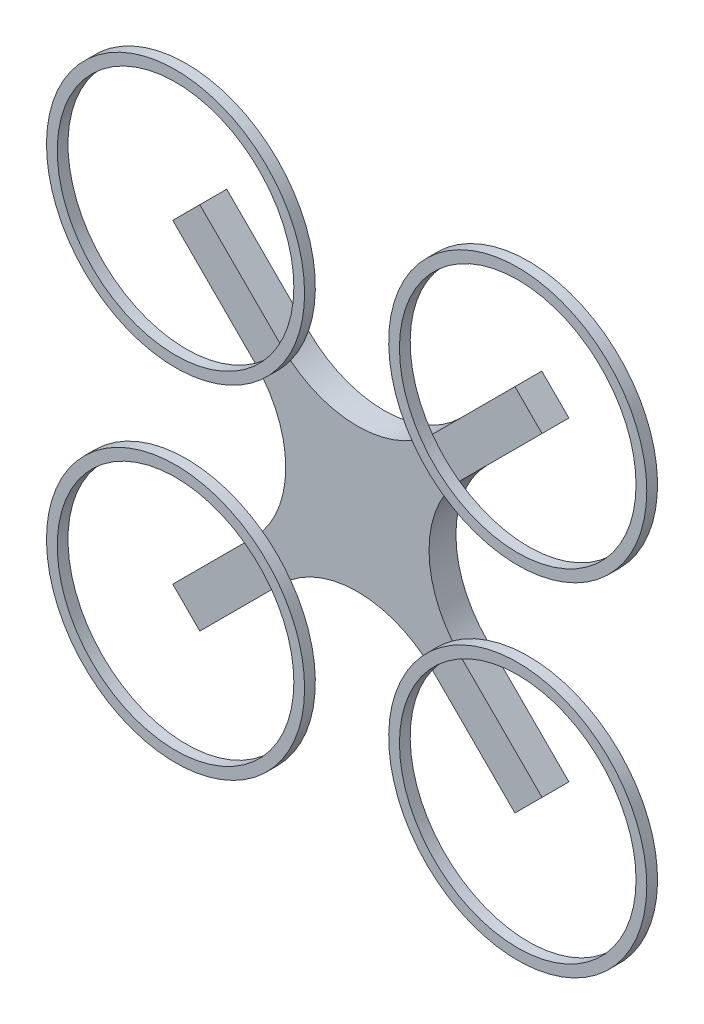
ISO-10303-21;
HEADER;
FILE_DESCRIPTION(('STEP AP214'),'2;1');
FILE_NAME('part.step','',(''),(''),'','','');
FILE_SCHEMA(('AUTOMOTIVE_DESIGN { 1 0 10303 214 1 1 1 1 }'));
ENDSEC;
DATA;
#1=APPLICATION_CONTEXT('core data for automotive mechanical design processes');
#2=APPLICATION_PROTOCOL_DEFINITION('international standard','automotive_design',2000,#1);
#3=PRODUCT_CONTEXT('',#1,'mechanical');
#4=PRODUCT('Part','Part','',(#3));
#5=PRODUCT_RELATED_PRODUCT_CATEGORY('part','',(#4));
#6=PRODUCT_DEFINITION_FORMATION('','',#4);
#7=PRODUCT_DEFINITION_CONTEXT('part definition',#1,'design');
#8=PRODUCT_DEFINITION('design','',#6,#7);
#9=PRODUCT_DEFINITION_SHAPE('','',#8);
#10=(LENGTH_UNIT() NAMED_UNIT(*) SI_UNIT(.MILLI.,.METRE.));
#11=(NAMED_UNIT(*) PLANE_ANGLE_UNIT() SI_UNIT($,.RADIAN.));
#12=(NAMED_UNIT(*) SI_UNIT($,.STERADIAN.) SOLID_ANGLE_UNIT());
#13=UNCERTAINTY_MEASURE_WITH_UNIT(LENGTH_MEASURE(1.E-05),#10,'distance_accuracy_value','');
#14=(GEOMETRIC_REPRESENTATION_CONTEXT(3) GLOBAL_UNCERTAINTY_ASSIGNED_CONTEXT((#13)) GLOBAL_UNIT_ASSIGNED_CONTEXT((#10,
#11,#12)) REPRESENTATION_CONTEXT('',''));
#15=CARTESIAN_POINT('',(0.,0.,0.));
#16=DIRECTION('',(0.,0.,1.));
#17=DIRECTION('',(1.,0.,0.));
#18=AXIS2_PLACEMENT_3D('',#15,#16,#17);
#19=CARTESIAN_POINT('',(0.,0.,5.));
#20=DIRECTION('',(0.,0.,1.));
#21=DIRECTION('',(1.,0.,0.));
#22=AXIS2_PLACEMENT_3D('',#19,#20,#21);
#23=PLANE('',#22);
#24=CARTESIAN_POINT('',(-31.8198051533946,-31.8198051533946,5.));
#25=DIRECTION('',(0.,0.,1.));
#26=DIRECTION('',(1.,0.,0.));
#27=AXIS2_PLACEMENT_3D('',#24,#25,#26);
#28=CIRCLE('',#27,22.);
#29=CARTESIAN_POINT('',(-13.9480439133865,-18.9901461485674,5.));
#30=VERTEX_POINT('',#29);
#31=CARTESIAN_POINT('',(-18.9901461485674,-13.9480439133865,5.));
#32=VERTEX_POINT('',#31);
#33=EDGE_CURVE('E52',#30,#32,#28,.T.);
#34=ORIENTED_EDGE('',*,*,#33,.T.);
#35=CARTESIAN_POINT('',(-33.323745521727,0.,5.));
#36=DIRECTION('',(0.,0.,1.));
#37=DIRECTION('',(1.,0.,0.));
#38=AXIS2_PLACEMENT_3D('',#35,#36,#37);
#39=CIRCLE('',#38,20.);
#40=CARTESIAN_POINT('',(-19.1816098979961,-14.142135623731,5.));
#41=VERTEX_POINT('',#40);
#42=EDGE_CURVE('E386',#32,#41,#39,.F.);
#43=ORIENTED_EDGE('',*,*,#42,.T.);
#44=DIRECTION('',(-0.707106781186548,-0.707106781186548,0.));
#45=VECTOR('',#44,1.);
#46=CARTESIAN_POINT('',(-34.3395422905272,-29.3000680162621,5.));
#47=LINE('',#46,#45);
#48=CARTESIAN_POINT('',(-34.3395422905272,-29.3000680162621,5.));
#49=VERTEX_POINT('',#48);
#50=EDGE_CURVE('E304',#41,#49,#47,.T.);
#51=ORIENTED_EDGE('',*,*,#50,.T.);
#52=DIRECTION('',(0.707106781186548,-0.707106781186548,0.));
#53=VECTOR('',#52,1.);
#54=CARTESIAN_POINT('',(-29.3000680162621,-34.3395422905272,5.));
#55=LINE('',#54,#53);
#56=CARTESIAN_POINT('',(-29.3000680162621,-34.3395422905272,5.));
#57=VERTEX_POINT('',#56);
#58=EDGE_CURVE('E306',#49,#57,#55,.T.);
#59=ORIENTED_EDGE('',*,*,#58,.T.);
#60=DIRECTION('',(0.707106781186548,0.707106781186547,0.));
#61=VECTOR('',#60,1.);
#62=CARTESIAN_POINT('',(0.,-5.03947427426513,5.));
#63=LINE('',#62,#61);
#64=CARTESIAN_POINT('',(-14.1421356237309,-19.1816098979961,5.));
#65=VERTEX_POINT('',#64);
#66=EDGE_CURVE('E308',#57,#65,#63,.T.);
#67=ORIENTED_EDGE('',*,*,#66,.T.);
#68=CARTESIAN_POINT('',(0.,-33.323745521727,5.));
#69=DIRECTION('',(0.,0.,1.));
#70=DIRECTION('',(1.,0.,0.));
#71=AXIS2_PLACEMENT_3D('',#68,#69,#70);
#72=CIRCLE('',#71,20.);
#73=EDGE_CURVE('E213',#65,#30,#72,.F.);
#74=ORIENTED_EDGE('',*,*,#73,.T.);
#75=EDGE_LOOP('',(#34,#43,#51,#59,#67,#74));
#76=FACE_BOUND('',#75,.T.);
#77=ADVANCED_FACE('F35',(#76),#23,.T.);
#78=CARTESIAN_POINT('',(31.8198051533946,-31.8198051533946,5.));
#79=DIRECTION('',(0.,0.,1.));
#80=DIRECTION('',(1.,0.,0.));
#81=AXIS2_PLACEMENT_3D('',#78,#79,#80);
#82=CIRCLE('',#81,22.);
#83=CARTESIAN_POINT('',(18.9901461485674,-13.9480439133865,5.));
#84=VERTEX_POINT('',#83);
#85=CARTESIAN_POINT('',(13.9480439133865,-18.9901461485674,5.));
#86=VERTEX_POINT('',#85);
#87=EDGE_CURVE('E243',#84,#86,#82,.T.);
#88=ORIENTED_EDGE('',*,*,#87,.T.);
#89=CARTESIAN_POINT('',(14.1421356237309,-19.1816098979961,5.));
#90=VERTEX_POINT('',#89);
#91=EDGE_CURVE('E211',#86,#90,#72,.F.);
#92=ORIENTED_EDGE('',*,*,#91,.T.);
#93=DIRECTION('',(0.707106781186548,-0.707106781186547,0.));
#94=VECTOR('',#93,1.);
#95=CARTESIAN_POINT('',(0.,-5.03947427426513,5.));
#96=LINE('',#95,#94);
#97=CARTESIAN_POINT('',(29.3000680162621,-34.3395422905272,5.));
#98=VERTEX_POINT('',#97);
#99=EDGE_CURVE('E311',#90,#98,#96,.T.);
#100=ORIENTED_EDGE('',*,*,#99,.T.);
#101=DIRECTION('',(0.707106781186548,0.707106781186548,0.));
#102=VECTOR('',#101,1.);
#103=CARTESIAN_POINT('',(29.3000680162621,-34.3395422905272,5.));
#104=LINE('',#103,#102);
#105=CARTESIAN_POINT('',(34.3395422905272,-29.3000680162621,5.));
#106=VERTEX_POINT('',#105);
#107=EDGE_CURVE('E283',#98,#106,#104,.T.);
#108=ORIENTED_EDGE('',*,*,#107,.T.);
#109=DIRECTION('',(-0.707106781186548,0.707106781186548,0.));
#110=VECTOR('',#109,1.);
#111=CARTESIAN_POINT('',(34.3395422905272,-29.3000680162621,5.));
#112=LINE('',#111,#110);
#113=CARTESIAN_POINT('',(19.1816098979961,-14.142135623731,5.));
#114=VERTEX_POINT('',#113);
#115=EDGE_CURVE('E286',#106,#114,#112,.T.);
#116=ORIENTED_EDGE('',*,*,#115,.T.);
#117=CARTESIAN_POINT('',(33.323745521727,0.,5.));
#118=DIRECTION('',(0.,0.,1.));
#119=DIRECTION('',(1.,0.,0.));
#120=AXIS2_PLACEMENT_3D('',#117,#118,#119);
#121=CIRCLE('',#120,20.);
#122=EDGE_CURVE('E396',#114,#84,#121,.F.);
#123=ORIENTED_EDGE('',*,*,#122,.T.);
#124=EDGE_LOOP('',(#88,#92,#100,#108,#116,#123));
#125=FACE_BOUND('',#124,.T.);
#126=ADVANCED_FACE('F472',(#125),#23,.T.);
#127=CARTESIAN_POINT('',(31.8198051533946,31.8198051533946,5.));
#128=DIRECTION('',(0.,0.,1.));
#129=DIRECTION('',(1.,0.,0.));
#130=AXIS2_PLACEMENT_3D('',#127,#128,#129);
#131=CIRCLE('',#130,22.);
#132=CARTESIAN_POINT('',(13.9480439133865,18.9901461485674,5.));
#133=VERTEX_POINT('',#132);
#134=CARTESIAN_POINT('',(18.9901461485674,13.9480439133865,5.));
#135=VERTEX_POINT('',#134);
#136=EDGE_CURVE('E257',#133,#135,#131,.T.);
#137=ORIENTED_EDGE('',*,*,#136,.T.);
#138=CARTESIAN_POINT('',(19.1816098979961,14.142135623731,5.));
#139=VERTEX_POINT('',#138);
#140=EDGE_CURVE('E395',#135,#139,#121,.F.);
#141=ORIENTED_EDGE('',*,*,#140,.T.);
#142=DIRECTION('',(0.707106781186548,0.707106781186548,0.));
#143=VECTOR('',#142,1.);
#144=CARTESIAN_POINT('',(34.3395422905272,29.3000680162621,5.));
#145=LINE('',#144,#143);
#146=CARTESIAN_POINT('',(34.3395422905272,29.3000680162621,5.));
#147=VERTEX_POINT('',#146);
#148=EDGE_CURVE('E290',#139,#147,#145,.T.);
#149=ORIENTED_EDGE('',*,*,#148,.T.);
#150=DIRECTION('',(-0.707106781186548,0.707106781186548,0.));
#151=VECTOR('',#150,1.);
#152=CARTESIAN_POINT('',(29.3000680162621,34.3395422905272,5.));
#153=LINE('',#152,#151);
#154=CARTESIAN_POINT('',(29.3000680162621,34.3395422905272,5.));
#155=VERTEX_POINT('',#154);
#156=EDGE_CURVE('E292',#147,#155,#153,.T.);
#157=ORIENTED_EDGE('',*,*,#156,.T.);
#158=DIRECTION('',(-0.707106781186548,-0.707106781186547,0.));
#159=VECTOR('',#158,1.);
#160=CARTESIAN_POINT('',(0.,5.03947427426513,5.));
#161=LINE('',#160,#159);
#162=CARTESIAN_POINT('',(14.1421356237309,19.1816098979961,5.));
#163=VERTEX_POINT('',#162);
#164=EDGE_CURVE('E294',#155,#163,#161,.T.);
#165=ORIENTED_EDGE('',*,*,#164,.T.);
#166=CARTESIAN_POINT('',(0.,33.323745521727,5.));
#167=DIRECTION('',(0.,0.,1.));
#168=DIRECTION('',(1.,0.,0.));
#169=AXIS2_PLACEMENT_3D('',#166,#167,#168);
#170=CIRCLE('',#169,20.);
#171=EDGE_CURVE('E11',#163,#133,#170,.F.);
#172=ORIENTED_EDGE('',*,*,#171,.T.);
#173=EDGE_LOOP('',(#137,#141,#149,#157,#165,#172));
#174=FACE_BOUND('',#173,.T.);
#175=ADVANCED_FACE('F490',(#174),#23,.T.);
#176=CARTESIAN_POINT('',(-19.1816098979961,14.142135623731,5.));
#177=VERTEX_POINT('',#176);
#178=CARTESIAN_POINT('',(-18.9901461485674,13.9480439133865,5.));
#179=VERTEX_POINT('',#178);
#180=EDGE_CURVE('E387',#177,#179,#39,.F.);
#181=ORIENTED_EDGE('',*,*,#180,.T.);
#182=CARTESIAN_POINT('',(-31.8198051533946,31.8198051533946,5.));
#183=DIRECTION('',(0.,0.,1.));
#184=DIRECTION('',(1.,0.,0.));
#185=AXIS2_PLACEMENT_3D('',#182,#183,#184);
#186=CIRCLE('',#185,22.);
#187=CARTESIAN_POINT('',(-13.9480439133865,18.9901461485674,5.));
#188=VERTEX_POINT('',#187);
#189=EDGE_CURVE('E273',#179,#188,#186,.T.);
#190=ORIENTED_EDGE('',*,*,#189,.T.);
#191=CARTESIAN_POINT('',(-14.1421356237309,19.1816098979961,5.));
#192=VERTEX_POINT('',#191);
#193=EDGE_CURVE('E401',#188,#192,#170,.F.);
#194=ORIENTED_EDGE('',*,*,#193,.T.);
#195=DIRECTION('',(-0.707106781186548,0.707106781186547,0.));
#196=VECTOR('',#195,1.);
#197=CARTESIAN_POINT('',(0.,5.03947427426513,5.));
#198=LINE('',#197,#196);
#199=CARTESIAN_POINT('',(-29.3000680162621,34.3395422905272,5.));
#200=VERTEX_POINT('',#199);
#201=EDGE_CURVE('E297',#192,#200,#198,.T.);
#202=ORIENTED_EDGE('',*,*,#201,.T.);
#203=DIRECTION('',(-0.707106781186548,-0.707106781186548,0.));
#204=VECTOR('',#203,1.);
#205=CARTESIAN_POINT('',(-29.3000680162621,34.3395422905272,5.));
#206=LINE('',#205,#204);
#207=CARTESIAN_POINT('',(-34.3395422905272,29.3000680162621,5.));
#208=VERTEX_POINT('',#207);
#209=EDGE_CURVE('E299',#200,#208,#206,.T.);
#210=ORIENTED_EDGE('',*,*,#209,.T.);
#211=DIRECTION('',(0.707106781186548,-0.707106781186548,0.));
#212=VECTOR('',#211,1.);
#213=CARTESIAN_POINT('',(-34.3395422905272,29.3000680162621,5.));
#214=LINE('',#213,#212);
#215=EDGE_CURVE('E301',#208,#177,#214,.T.);
#216=ORIENTED_EDGE('',*,*,#215,.T.);
#217=EDGE_LOOP('',(#181,#190,#194,#202,#210,#216));
#218=FACE_BOUND('',#217,.T.);
#219=ADVANCED_FACE('F443',(#218),#23,.T.);
#220=CARTESIAN_POINT('',(29.3000680162621,-34.3395422905272,5.));
#221=DIRECTION('',(-0.707106781186548,0.707106781186548,0.));
#222=DIRECTION('',(-0.707106781186548,-0.707106781186548,0.));
#223=AXIS2_PLACEMENT_3D('',#220,#221,#222);
#224=PLANE('',#223);
#225=DIRECTION('',(0.707106781186548,0.707106781186548,0.));
#226=VECTOR('',#225,1.);
#227=CARTESIAN_POINT('',(29.3000680162621,-34.3395422905272,0.));
#228=LINE('',#227,#226);
#229=CARTESIAN_POINT('',(29.3000680162621,-34.3395422905272,0.));
#230=VERTEX_POINT('',#229);
#231=CARTESIAN_POINT('',(34.3395422905272,-29.3000680162621,0.));
#232=VERTEX_POINT('',#231);
#233=EDGE_CURVE('E279',#230,#232,#228,.T.);
#234=ORIENTED_EDGE('',*,*,#233,.T.);
#235=DIRECTION('',(0.,0.,-1.));
#236=VECTOR('',#235,1.);
#237=CARTESIAN_POINT('',(34.3395422905272,-29.3000680162621,5.));
#238=LINE('',#237,#236);
#239=EDGE_CURVE('E361',#106,#232,#238,.T.);
#240=ORIENTED_EDGE('',*,*,#239,.F.);
#241=ORIENTED_EDGE('',*,*,#107,.F.);
#242=DIRECTION('',(0.,0.,-1.));
#243=VECTOR('',#242,1.);
#244=CARTESIAN_POINT('',(29.3000680162621,-34.3395422905272,5.));
#245=LINE('',#244,#243);
#246=EDGE_CURVE('E313',#98,#230,#245,.T.);
#247=ORIENTED_EDGE('',*,*,#246,.T.);
#248=EDGE_LOOP('',(#234,#240,#241,#247));
#249=FACE_BOUND('',#248,.T.);
#250=ADVANCED_FACE('F469',(#249),#224,.F.);
#251=CARTESIAN_POINT('',(34.3395422905272,-29.3000680162621,5.));
#252=DIRECTION('',(-0.707106781186548,-0.707106781186548,0.));
#253=DIRECTION('',(0.707106781186548,-0.707106781186548,0.));
#254=AXIS2_PLACEMENT_3D('',#251,#252,#253);
#255=PLANE('',#254);
#256=DIRECTION('',(-0.707106781186548,0.707106781186548,0.));
#257=VECTOR('',#256,1.);
#258=CARTESIAN_POINT('',(34.3395422905272,-29.3000680162621,0.));
#259=LINE('',#258,#257);
#260=CARTESIAN_POINT('',(19.1816098979961,-14.142135623731,0.));
#261=VERTEX_POINT('',#260);
#262=EDGE_CURVE('E316',#232,#261,#259,.T.);
#263=ORIENTED_EDGE('',*,*,#262,.T.);
#264=DIRECTION('',(0.,0.,-1.));
#265=VECTOR('',#264,1.);
#266=CARTESIAN_POINT('',(19.1816098979961,-14.142135623731,5.));
#267=LINE('',#266,#265);
#268=EDGE_CURVE('E377',#261,#114,#267,.F.);
#269=ORIENTED_EDGE('',*,*,#268,.T.);
#270=ORIENTED_EDGE('',*,*,#115,.F.);
#271=ORIENTED_EDGE('',*,*,#239,.T.);
#272=EDGE_LOOP('',(#263,#269,#270,#271));
#273=FACE_BOUND('',#272,.T.);
#274=ADVANCED_FACE('F500',(#273),#255,.F.);
#275=CARTESIAN_POINT('',(34.3395422905272,29.3000680162621,5.));
#276=DIRECTION('',(-0.707106781186548,0.707106781186548,0.));
#277=DIRECTION('',(-0.707106781186548,-0.707106781186548,0.));
#278=AXIS2_PLACEMENT_3D('',#275,#276,#277);
#279=PLANE('',#278);
#280=ORIENTED_EDGE('',*,*,#148,.F.);
#281=DIRECTION('',(0.,0.,-1.));
#282=VECTOR('',#281,1.);
#283=CARTESIAN_POINT('',(19.1816098979961,14.142135623731,0.));
#284=LINE('',#283,#282);
#285=CARTESIAN_POINT('',(19.1816098979961,14.142135623731,0.));
#286=VERTEX_POINT('',#285);
#287=EDGE_CURVE('E374',#139,#286,#284,.T.);
#288=ORIENTED_EDGE('',*,*,#287,.T.);
#289=DIRECTION('',(0.707106781186548,0.707106781186548,0.));
#290=VECTOR('',#289,1.);
#291=CARTESIAN_POINT('',(34.3395422905272,29.3000680162621,0.));
#292=LINE('',#291,#290);
#293=CARTESIAN_POINT('',(34.3395422905272,29.3000680162621,0.));
#294=VERTEX_POINT('',#293);
#295=EDGE_CURVE('E319',#286,#294,#292,.T.);
#296=ORIENTED_EDGE('',*,*,#295,.T.);
#297=DIRECTION('',(0.,0.,-1.));
#298=VECTOR('',#297,1.);
#299=CARTESIAN_POINT('',(34.3395422905272,29.3000680162621,5.));
#300=LINE('',#299,#298);
#301=EDGE_CURVE('E358',#147,#294,#300,.T.);
#302=ORIENTED_EDGE('',*,*,#301,.F.);
#303=EDGE_LOOP('',(#280,#288,#296,#302));
#304=FACE_BOUND('',#303,.T.);
#305=ADVANCED_FACE('F495',(#304),#279,.F.);
#306=CARTESIAN_POINT('',(29.3000680162621,34.3395422905272,5.));
#307=DIRECTION('',(-0.707106781186548,-0.707106781186548,0.));
#308=DIRECTION('',(0.707106781186548,-0.707106781186548,0.));
#309=AXIS2_PLACEMENT_3D('',#306,#307,#308);
#310=PLANE('',#309);
#311=DIRECTION('',(-0.707106781186548,0.707106781186548,0.));
#312=VECTOR('',#311,1.);
#313=CARTESIAN_POINT('',(29.3000680162621,34.3395422905272,0.));
#314=LINE('',#313,#312);
#315=CARTESIAN_POINT('',(29.3000680162621,34.3395422905272,0.));
#316=VERTEX_POINT('',#315);
#317=EDGE_CURVE('E321',#294,#316,#314,.T.);
#318=ORIENTED_EDGE('',*,*,#317,.T.);
#319=DIRECTION('',(0.,0.,-1.));
#320=VECTOR('',#319,1.);
#321=CARTESIAN_POINT('',(29.3000680162621,34.3395422905272,5.));
#322=LINE('',#321,#320);
#323=EDGE_CURVE('E355',#155,#316,#322,.T.);
#324=ORIENTED_EDGE('',*,*,#323,.F.);
#325=ORIENTED_EDGE('',*,*,#156,.F.);
#326=ORIENTED_EDGE('',*,*,#301,.T.);
#327=EDGE_LOOP('',(#318,#324,#325,#326));
#328=FACE_BOUND('',#327,.T.);
#329=ADVANCED_FACE('F507',(#328),#310,.F.);
#330=CARTESIAN_POINT('',(0.,5.03947427426513,5.));
#331=DIRECTION('',(0.707106781186547,-0.707106781186548,0.));
#332=DIRECTION('',(0.707106781186548,0.707106781186547,0.));
#333=AXIS2_PLACEMENT_3D('',#330,#331,#332);
#334=PLANE('',#333);
#335=DIRECTION('',(-0.707106781186548,-0.707106781186547,0.));
#336=VECTOR('',#335,1.);
#337=CARTESIAN_POINT('',(0.,5.03947427426513,0.));
#338=LINE('',#337,#336);
#339=CARTESIAN_POINT('',(14.1421356237309,19.1816098979961,0.));
#340=VERTEX_POINT('',#339);
#341=EDGE_CURVE('E323',#316,#340,#338,.T.);
#342=ORIENTED_EDGE('',*,*,#341,.T.);
#343=DIRECTION('',(0.,0.,-1.));
#344=VECTOR('',#343,1.);
#345=CARTESIAN_POINT('',(14.142135623731,19.1816098979961,5.));
#346=LINE('',#345,#344);
#347=EDGE_CURVE('E382',#340,#163,#346,.F.);
#348=ORIENTED_EDGE('',*,*,#347,.T.);
#349=ORIENTED_EDGE('',*,*,#164,.F.);
#350=ORIENTED_EDGE('',*,*,#323,.T.);
#351=EDGE_LOOP('',(#342,#348,#349,#350));
#352=FACE_BOUND('',#351,.T.);
#353=ADVANCED_FACE('F590',(#352),#334,.F.);
#354=CARTESIAN_POINT('',(0.,5.03947427426513,5.));
#355=DIRECTION('',(-0.707106781186547,-0.707106781186548,0.));
#356=DIRECTION('',(0.707106781186548,-0.707106781186547,0.));
#357=AXIS2_PLACEMENT_3D('',#354,#355,#356);
#358=PLANE('',#357);
#359=ORIENTED_EDGE('',*,*,#201,.F.);
#360=DIRECTION('',(0.,0.,-1.));
#361=VECTOR('',#360,1.);
#362=CARTESIAN_POINT('',(-14.142135623731,19.1816098979961,0.));
#363=LINE('',#362,#361);
#364=CARTESIAN_POINT('',(-14.1421356237309,19.1816098979961,0.));
#365=VERTEX_POINT('',#364);
#366=EDGE_CURVE('E379',#192,#365,#363,.T.);
#367=ORIENTED_EDGE('',*,*,#366,.T.);
#368=DIRECTION('',(-0.707106781186548,0.707106781186547,0.));
#369=VECTOR('',#368,1.);
#370=CARTESIAN_POINT('',(0.,5.03947427426513,0.));
#371=LINE('',#370,#369);
#372=CARTESIAN_POINT('',(-29.3000680162621,34.3395422905272,0.));
#373=VERTEX_POINT('',#372);
#374=EDGE_CURVE('E326',#365,#373,#371,.T.);
#375=ORIENTED_EDGE('',*,*,#374,.T.);
#376=DIRECTION('',(0.,0.,-1.));
#377=VECTOR('',#376,1.);
#378=CARTESIAN_POINT('',(-29.3000680162621,34.3395422905272,5.));
#379=LINE('',#378,#377);
#380=EDGE_CURVE('E352',#200,#373,#379,.T.);
#381=ORIENTED_EDGE('',*,*,#380,.F.);
#382=EDGE_LOOP('',(#359,#367,#375,#381));
#383=FACE_BOUND('',#382,.T.);
#384=ADVANCED_FACE('F428',(#383),#358,.F.);
#385=CARTESIAN_POINT('',(-29.3000680162621,34.3395422905272,5.));
#386=DIRECTION('',(0.707106781186548,-0.707106781186548,0.));
#387=DIRECTION('',(0.707106781186548,0.707106781186548,0.));
#388=AXIS2_PLACEMENT_3D('',#385,#386,#387);
#389=PLANE('',#388);
#390=DIRECTION('',(-0.707106781186548,-0.707106781186548,0.));
#391=VECTOR('',#390,1.);
#392=CARTESIAN_POINT('',(-29.3000680162621,34.3395422905272,0.));
#393=LINE('',#392,#391);
#394=CARTESIAN_POINT('',(-34.3395422905272,29.3000680162621,0.));
#395=VERTEX_POINT('',#394);
#396=EDGE_CURVE('E328',#373,#395,#393,.T.);
#397=ORIENTED_EDGE('',*,*,#396,.T.);
#398=DIRECTION('',(0.,0.,-1.));
#399=VECTOR('',#398,1.);
#400=CARTESIAN_POINT('',(-34.3395422905272,29.3000680162621,5.));
#401=LINE('',#400,#399);
#402=EDGE_CURVE('E349',#208,#395,#401,.T.);
#403=ORIENTED_EDGE('',*,*,#402,.F.);
#404=ORIENTED_EDGE('',*,*,#209,.F.);
#405=ORIENTED_EDGE('',*,*,#380,.T.);
#406=EDGE_LOOP('',(#397,#403,#404,#405));
#407=FACE_BOUND('',#406,.T.);
#408=ADVANCED_FACE('F436',(#407),#389,.F.);
#409=CARTESIAN_POINT('',(-34.3395422905272,29.3000680162621,5.));
#410=DIRECTION('',(0.707106781186548,0.707106781186548,0.));
#411=DIRECTION('',(-0.707106781186548,0.707106781186548,0.));
#412=AXIS2_PLACEMENT_3D('',#409,#410,#411);
#413=PLANE('',#412);
#414=DIRECTION('',(0.707106781186548,-0.707106781186548,0.));
#415=VECTOR('',#414,1.);
#416=CARTESIAN_POINT('',(-34.3395422905272,29.3000680162621,0.));
#417=LINE('',#416,#415);
#418=CARTESIAN_POINT('',(-19.1816098979961,14.142135623731,0.));
#419=VERTEX_POINT('',#418);
#420=EDGE_CURVE('E330',#395,#419,#417,.T.);
#421=ORIENTED_EDGE('',*,*,#420,.T.);
#422=DIRECTION('',(0.,0.,-1.));
#423=VECTOR('',#422,1.);
#424=CARTESIAN_POINT('',(-19.1816098979961,14.142135623731,5.));
#425=LINE('',#424,#423);
#426=EDGE_CURVE('E367',#419,#177,#425,.F.);
#427=ORIENTED_EDGE('',*,*,#426,.T.);
#428=ORIENTED_EDGE('',*,*,#215,.F.);
#429=ORIENTED_EDGE('',*,*,#402,.T.);
#430=EDGE_LOOP('',(#421,#427,#428,#429));
#431=FACE_BOUND('',#430,.T.);
#432=ADVANCED_FACE('F440',(#431),#413,.F.);
#433=CARTESIAN_POINT('',(-34.3395422905272,-29.3000680162621,5.));
#434=DIRECTION('',(0.707106781186548,-0.707106781186548,0.));
#435=DIRECTION('',(0.707106781186548,0.707106781186548,0.));
#436=AXIS2_PLACEMENT_3D('',#433,#434,#435);
#437=PLANE('',#436);
#438=ORIENTED_EDGE('',*,*,#50,.F.);
#439=DIRECTION('',(0.,0.,-1.));
#440=VECTOR('',#439,1.);
#441=CARTESIAN_POINT('',(-19.1816098979961,-14.142135623731,0.));
#442=LINE('',#441,#440);
#443=CARTESIAN_POINT('',(-19.1816098979961,-14.142135623731,0.));
#444=VERTEX_POINT('',#443);
#445=EDGE_CURVE('E364',#41,#444,#442,.T.);
#446=ORIENTED_EDGE('',*,*,#445,.T.);
#447=DIRECTION('',(-0.707106781186548,-0.707106781186548,0.));
#448=VECTOR('',#447,1.);
#449=CARTESIAN_POINT('',(-34.3395422905272,-29.3000680162621,0.));
#450=LINE('',#449,#448);
#451=CARTESIAN_POINT('',(-34.3395422905272,-29.3000680162621,0.));
#452=VERTEX_POINT('',#451);
#453=EDGE_CURVE('E333',#444,#452,#450,.T.);
#454=ORIENTED_EDGE('',*,*,#453,.T.);
#455=DIRECTION('',(0.,0.,-1.));
#456=VECTOR('',#455,1.);
#457=CARTESIAN_POINT('',(-34.3395422905272,-29.3000680162621,5.));
#458=LINE('',#457,#456);
#459=EDGE_CURVE('E346',#49,#452,#458,.T.);
#460=ORIENTED_EDGE('',*,*,#459,.F.);
#461=EDGE_LOOP('',(#438,#446,#454,#460));
#462=FACE_BOUND('',#461,.T.);
#463=ADVANCED_FACE('F449',(#462),#437,.F.);
#464=CARTESIAN_POINT('',(-29.3000680162621,-34.3395422905272,5.));
#465=DIRECTION('',(0.707106781186548,0.707106781186548,0.));
#466=DIRECTION('',(-0.707106781186548,0.707106781186548,0.));
#467=AXIS2_PLACEMENT_3D('',#464,#465,#466);
#468=PLANE('',#467);
#469=DIRECTION('',(0.707106781186548,-0.707106781186548,0.));
#470=VECTOR('',#469,1.);
#471=CARTESIAN_POINT('',(-29.3000680162621,-34.3395422905272,0.));
#472=LINE('',#471,#470);
#473=CARTESIAN_POINT('',(-29.3000680162621,-34.3395422905272,0.));
#474=VERTEX_POINT('',#473);
#475=EDGE_CURVE('E335',#452,#474,#472,.T.);
#476=ORIENTED_EDGE('',*,*,#475,.T.);
#477=DIRECTION('',(0.,0.,-1.));
#478=VECTOR('',#477,1.);
#479=CARTESIAN_POINT('',(-29.3000680162621,-34.3395422905272,5.));
#480=LINE('',#479,#478);
#481=EDGE_CURVE('E343',#57,#474,#480,.T.);
#482=ORIENTED_EDGE('',*,*,#481,.F.);
#483=ORIENTED_EDGE('',*,*,#58,.F.);
#484=ORIENTED_EDGE('',*,*,#459,.T.);
#485=EDGE_LOOP('',(#476,#482,#483,#484));
#486=FACE_BOUND('',#485,.T.);
#487=ADVANCED_FACE('F455',(#486),#468,.F.);
#488=CARTESIAN_POINT('',(0.,-5.03947427426513,5.));
#489=DIRECTION('',(-0.707106781186547,0.707106781186548,0.));
#490=DIRECTION('',(-0.707106781186548,-0.707106781186547,0.));
#491=AXIS2_PLACEMENT_3D('',#488,#489,#490);
#492=PLANE('',#491);
#493=DIRECTION('',(0.707106781186548,0.707106781186547,0.));
#494=VECTOR('',#493,1.);
#495=CARTESIAN_POINT('',(0.,-5.03947427426513,0.));
#496=LINE('',#495,#494);
#497=CARTESIAN_POINT('',(-14.1421356237309,-19.1816098979961,0.));
#498=VERTEX_POINT('',#497);
#499=EDGE_CURVE('E337',#474,#498,#496,.T.);
#500=ORIENTED_EDGE('',*,*,#499,.T.);
#501=DIRECTION('',(0.,0.,-1.));
#502=VECTOR('',#501,1.);
#503=CARTESIAN_POINT('',(-14.142135623731,-19.1816098979961,5.));
#504=LINE('',#503,#502);
#505=EDGE_CURVE('E372',#498,#65,#504,.F.);
#506=ORIENTED_EDGE('',*,*,#505,.T.);
#507=ORIENTED_EDGE('',*,*,#66,.F.);
#508=ORIENTED_EDGE('',*,*,#481,.T.);
#509=EDGE_LOOP('',(#500,#506,#507,#508));
#510=FACE_BOUND('',#509,.T.);
#511=ADVANCED_FACE('F461',(#510),#492,.F.);
#512=CARTESIAN_POINT('',(0.,-5.03947427426513,5.));
#513=DIRECTION('',(0.707106781186547,0.707106781186548,0.));
#514=DIRECTION('',(-0.707106781186548,0.707106781186547,0.));
#515=AXIS2_PLACEMENT_3D('',#512,#513,#514);
#516=PLANE('',#515);
#517=ORIENTED_EDGE('',*,*,#99,.F.);
#518=DIRECTION('',(0.,0.,-1.));
#519=VECTOR('',#518,1.);
#520=CARTESIAN_POINT('',(14.142135623731,-19.1816098979961,0.));
#521=LINE('',#520,#519);
#522=CARTESIAN_POINT('',(14.1421356237309,-19.1816098979961,0.));
#523=VERTEX_POINT('',#522);
#524=EDGE_CURVE('E369',#90,#523,#521,.T.);
#525=ORIENTED_EDGE('',*,*,#524,.T.);
#526=DIRECTION('',(0.707106781186548,-0.707106781186547,0.));
#527=VECTOR('',#526,1.);
#528=CARTESIAN_POINT('',(0.,-5.03947427426513,0.));
#529=LINE('',#528,#527);
#530=EDGE_CURVE('E287',#523,#230,#529,.T.);
#531=ORIENTED_EDGE('',*,*,#530,.T.);
#532=ORIENTED_EDGE('',*,*,#246,.F.);
#533=EDGE_LOOP('',(#517,#525,#531,#532));
#534=FACE_BOUND('',#533,.T.);
#535=ADVANCED_FACE('F466',(#534),#516,.F.);
#536=CARTESIAN_POINT('',(-17.6631495545587,12.4396838365415,5.));
#537=VERTEX_POINT('',#536);
#538=CARTESIAN_POINT('',(-17.6631495545587,-12.4396838365415,5.));
#539=VERTEX_POINT('',#538);
#540=EDGE_CURVE('E218',#537,#539,#39,.F.);
#541=ORIENTED_EDGE('',*,*,#540,.T.);
#542=CARTESIAN_POINT('',(-31.8198051533946,-31.8198051533946,5.));
#543=DIRECTION('',(0.,0.,1.));
#544=DIRECTION('',(1.,0.,0.));
#545=AXIS2_PLACEMENT_3D('',#542,#543,#544);
#546=CIRCLE('',#545,24.);
#547=CARTESIAN_POINT('',(-12.4396838365415,-17.6631495545587,5.));
#548=VERTEX_POINT('',#547);
#549=EDGE_CURVE('E215',#548,#539,#546,.T.);
#550=ORIENTED_EDGE('',*,*,#549,.F.);
#551=CARTESIAN_POINT('',(12.4396838365415,-17.6631495545587,5.));
#552=VERTEX_POINT('',#551);
#553=EDGE_CURVE('E199',#548,#552,#72,.F.);
#554=ORIENTED_EDGE('',*,*,#553,.T.);
#555=CARTESIAN_POINT('',(31.8198051533946,-31.8198051533946,5.));
#556=DIRECTION('',(0.,0.,1.));
#557=DIRECTION('',(1.,0.,0.));
#558=AXIS2_PLACEMENT_3D('',#555,#556,#557);
#559=CIRCLE('',#558,24.);
#560=CARTESIAN_POINT('',(17.6631495545587,-12.4396838365414,5.));
#561=VERTEX_POINT('',#560);
#562=EDGE_CURVE('E248',#561,#552,#559,.T.);
#563=ORIENTED_EDGE('',*,*,#562,.F.);
#564=CARTESIAN_POINT('',(17.6631495545587,12.4396838365415,5.));
#565=VERTEX_POINT('',#564);
#566=EDGE_CURVE('E400',#561,#565,#121,.F.);
#567=ORIENTED_EDGE('',*,*,#566,.T.);
#568=CARTESIAN_POINT('',(31.8198051533946,31.8198051533946,5.));
#569=DIRECTION('',(0.,0.,1.));
#570=DIRECTION('',(1.,0.,0.));
#571=AXIS2_PLACEMENT_3D('',#568,#569,#570);
#572=CIRCLE('',#571,24.);
#573=CARTESIAN_POINT('',(12.4396838365415,17.6631495545587,5.));
#574=VERTEX_POINT('',#573);
#575=EDGE_CURVE('E263',#574,#565,#572,.T.);
#576=ORIENTED_EDGE('',*,*,#575,.F.);
#577=CARTESIAN_POINT('',(-12.4396838365415,17.6631495545587,5.));
#578=VERTEX_POINT('',#577);
#579=EDGE_CURVE('E44',#574,#578,#170,.F.);
#580=ORIENTED_EDGE('',*,*,#579,.T.);
#581=CARTESIAN_POINT('',(-31.8198051533946,31.8198051533946,5.));
#582=DIRECTION('',(0.,0.,1.));
#583=DIRECTION('',(1.,0.,0.));
#584=AXIS2_PLACEMENT_3D('',#581,#582,#583);
#585=CIRCLE('',#584,24.);
#586=EDGE_CURVE('E280',#537,#578,#585,.T.);
#587=ORIENTED_EDGE('',*,*,#586,.F.);
#588=EDGE_LOOP('',(#541,#550,#554,#563,#567,#576,#580,#587));
#589=FACE_BOUND('',#588,.T.);
#590=ADVANCED_FACE('F216',(#589),#23,.T.);
#591=CARTESIAN_POINT('',(0.,0.,0.));
#592=DIRECTION('',(0.,0.,1.));
#593=DIRECTION('',(1.,0.,0.));
#594=AXIS2_PLACEMENT_3D('',#591,#592,#593);
#595=PLANE('',#594);
#596=ORIENTED_EDGE('',*,*,#233,.F.);
#597=ORIENTED_EDGE('',*,*,#530,.F.);
#598=CARTESIAN_POINT('',(0.,-33.323745521727,0.));
#599=DIRECTION('',(0.,0.,1.));
#600=DIRECTION('',(1.,0.,0.));
#601=AXIS2_PLACEMENT_3D('',#598,#599,#600);
#602=CIRCLE('',#601,20.);
#603=EDGE_CURVE('E390',#523,#498,#602,.T.);
#604=ORIENTED_EDGE('',*,*,#603,.T.);
#605=ORIENTED_EDGE('',*,*,#499,.F.);
#606=ORIENTED_EDGE('',*,*,#475,.F.);
#607=ORIENTED_EDGE('',*,*,#453,.F.);
#608=CARTESIAN_POINT('',(-33.323745521727,0.,0.));
#609=DIRECTION('',(0.,0.,1.));
#610=DIRECTION('',(1.,0.,0.));
#611=AXIS2_PLACEMENT_3D('',#608,#609,#610);
#612=CIRCLE('',#611,20.);
#613=EDGE_CURVE('E384',#444,#419,#612,.T.);
#614=ORIENTED_EDGE('',*,*,#613,.T.);
#615=ORIENTED_EDGE('',*,*,#420,.F.);
#616=ORIENTED_EDGE('',*,*,#396,.F.);
#617=ORIENTED_EDGE('',*,*,#374,.F.);
#618=CARTESIAN_POINT('',(0.,33.323745521727,0.));
#619=DIRECTION('',(0.,0.,1.));
#620=DIRECTION('',(1.,0.,0.));
#621=AXIS2_PLACEMENT_3D('',#618,#619,#620);
#622=CIRCLE('',#621,20.);
#623=EDGE_CURVE('E398',#365,#340,#622,.T.);
#624=ORIENTED_EDGE('',*,*,#623,.T.);
#625=ORIENTED_EDGE('',*,*,#341,.F.);
#626=ORIENTED_EDGE('',*,*,#317,.F.);
#627=ORIENTED_EDGE('',*,*,#295,.F.);
#628=CARTESIAN_POINT('',(33.323745521727,0.,0.));
#629=DIRECTION('',(0.,0.,1.));
#630=DIRECTION('',(1.,0.,0.));
#631=AXIS2_PLACEMENT_3D('',#628,#629,#630);
#632=CIRCLE('',#631,20.);
#633=EDGE_CURVE('E393',#286,#261,#632,.T.);
#634=ORIENTED_EDGE('',*,*,#633,.T.);
#635=ORIENTED_EDGE('',*,*,#262,.F.);
#636=EDGE_LOOP('',(#596,#597,#604,#605,#606,#607,#614,#615,#616,#617,#624,#625,#626,#627,#634,#635));
#637=FACE_BOUND('',#636,.T.);
#638=ADVANCED_FACE('F432',(#637),#595,.F.);
#639=CARTESIAN_POINT('',(-33.323745521727,0.,5.));
#640=DIRECTION('',(0.,0.,1.));
#641=DIRECTION('',(1.,0.,0.));
#642=AXIS2_PLACEMENT_3D('',#639,#640,#641);
#643=CYLINDRICAL_SURFACE('',#642,20.);
#644=ORIENTED_EDGE('',*,*,#180,.F.);
#645=ORIENTED_EDGE('',*,*,#426,.F.);
#646=ORIENTED_EDGE('',*,*,#613,.F.);
#647=ORIENTED_EDGE('',*,*,#445,.F.);
#648=ORIENTED_EDGE('',*,*,#42,.F.);
#649=CARTESIAN_POINT('',(-33.323745521727,0.,5.));
#650=DIRECTION('',(0.,0.,1.));
#651=DIRECTION('',(1.,0.,0.));
#652=AXIS2_PLACEMENT_3D('',#649,#650,#651);
#653=CIRCLE('',#652,20.);
#654=EDGE_CURVE('E59',#539,#32,#653,.F.);
#655=ORIENTED_EDGE('',*,*,#654,.F.);
#656=ORIENTED_EDGE('',*,*,#540,.F.);
#657=EDGE_CURVE('E391',#179,#537,#39,.F.);
#658=ORIENTED_EDGE('',*,*,#657,.F.);
#659=EDGE_LOOP('',(#644,#645,#646,#647,#648,#655,#656,#658));
#660=FACE_BOUND('',#659,.T.);
#661=ADVANCED_FACE('F444',(#660),#643,.F.);
#662=CARTESIAN_POINT('',(0.,-33.323745521727,5.));
#663=DIRECTION('',(0.,0.,1.));
#664=DIRECTION('',(1.,0.,0.));
#665=AXIS2_PLACEMENT_3D('',#662,#663,#664);
#666=CYLINDRICAL_SURFACE('',#665,20.);
#667=ORIENTED_EDGE('',*,*,#73,.F.);
#668=ORIENTED_EDGE('',*,*,#505,.F.);
#669=ORIENTED_EDGE('',*,*,#603,.F.);
#670=ORIENTED_EDGE('',*,*,#524,.F.);
#671=ORIENTED_EDGE('',*,*,#91,.F.);
#672=CARTESIAN_POINT('',(0.,-33.323745521727,5.));
#673=DIRECTION('',(0.,0.,1.));
#674=DIRECTION('',(1.,0.,0.));
#675=AXIS2_PLACEMENT_3D('',#672,#673,#674);
#676=CIRCLE('',#675,20.);
#677=EDGE_CURVE('E207',#552,#86,#676,.F.);
#678=ORIENTED_EDGE('',*,*,#677,.F.);
#679=ORIENTED_EDGE('',*,*,#553,.F.);
#680=EDGE_CURVE('E204',#30,#548,#72,.F.);
#681=ORIENTED_EDGE('',*,*,#680,.F.);
#682=EDGE_LOOP('',(#667,#668,#669,#670,#671,#678,#679,#681));
#683=FACE_BOUND('',#682,.T.);
#684=ADVANCED_FACE('F202',(#683),#666,.F.);
#685=CARTESIAN_POINT('',(33.323745521727,0.,5.));
#686=DIRECTION('',(0.,0.,1.));
#687=DIRECTION('',(1.,0.,0.));
#688=AXIS2_PLACEMENT_3D('',#685,#686,#687);
#689=CYLINDRICAL_SURFACE('',#688,20.);
#690=ORIENTED_EDGE('',*,*,#122,.F.);
#691=ORIENTED_EDGE('',*,*,#268,.F.);
#692=ORIENTED_EDGE('',*,*,#633,.F.);
#693=ORIENTED_EDGE('',*,*,#287,.F.);
#694=ORIENTED_EDGE('',*,*,#140,.F.);
#695=CARTESIAN_POINT('',(33.323745521727,0.,5.));
#696=DIRECTION('',(0.,0.,1.));
#697=DIRECTION('',(1.,0.,0.));
#698=AXIS2_PLACEMENT_3D('',#695,#696,#697);
#699=CIRCLE('',#698,20.);
#700=EDGE_CURVE('E262',#565,#135,#699,.F.);
#701=ORIENTED_EDGE('',*,*,#700,.F.);
#702=ORIENTED_EDGE('',*,*,#566,.F.);
#703=EDGE_CURVE('E399',#84,#561,#121,.F.);
#704=ORIENTED_EDGE('',*,*,#703,.F.);
#705=EDGE_LOOP('',(#690,#691,#692,#693,#694,#701,#702,#704));
#706=FACE_BOUND('',#705,.T.);
#707=ADVANCED_FACE('F485',(#706),#689,.F.);
#708=CARTESIAN_POINT('',(0.,33.323745521727,5.));
#709=DIRECTION('',(0.,0.,1.));
#710=DIRECTION('',(1.,0.,0.));
#711=AXIS2_PLACEMENT_3D('',#708,#709,#710);
#712=CYLINDRICAL_SURFACE('',#711,20.);
#713=ORIENTED_EDGE('',*,*,#171,.F.);
#714=ORIENTED_EDGE('',*,*,#347,.F.);
#715=ORIENTED_EDGE('',*,*,#623,.F.);
#716=ORIENTED_EDGE('',*,*,#366,.F.);
#717=ORIENTED_EDGE('',*,*,#193,.F.);
#718=EDGE_CURVE('E45',#578,#188,#170,.F.);
#719=ORIENTED_EDGE('',*,*,#718,.F.);
#720=ORIENTED_EDGE('',*,*,#579,.F.);
#721=EDGE_CURVE('E43',#133,#574,#170,.F.);
#722=ORIENTED_EDGE('',*,*,#721,.F.);
#723=EDGE_LOOP('',(#713,#714,#715,#716,#717,#719,#720,#722));
#724=FACE_BOUND('',#723,.T.);
#725=ADVANCED_FACE('F37',(#724),#712,.F.);
#726=CARTESIAN_POINT('',(-31.8198051533946,31.8198051533946,5.));
#727=DIRECTION('',(0.,0.,1.));
#728=DIRECTION('',(1.,0.,0.));
#729=AXIS2_PLACEMENT_3D('',#726,#727,#728);
#730=PLANE('',#729);
#731=EDGE_CURVE('E272',#578,#537,#585,.T.);
#732=ORIENTED_EDGE('',*,*,#731,.F.);
#733=ORIENTED_EDGE('',*,*,#718,.T.);
#734=EDGE_CURVE('E268',#188,#179,#186,.T.);
#735=ORIENTED_EDGE('',*,*,#734,.T.);
#736=ORIENTED_EDGE('',*,*,#657,.T.);
#737=EDGE_LOOP('',(#732,#733,#735,#736));
#738=FACE_BOUND('',#737,.T.);
#739=ADVANCED_FACE('F420',(#738),#730,.F.);
#740=CARTESIAN_POINT('',(-31.8198051533946,31.8198051533946,7.));
#741=DIRECTION('',(0.,0.,1.));
#742=DIRECTION('',(1.,0.,0.));
#743=AXIS2_PLACEMENT_3D('',#740,#741,#742);
#744=PLANE('',#743);
#745=CARTESIAN_POINT('',(-31.8198051533946,31.8198051533946,7.));
#746=DIRECTION('',(0.,0.,1.));
#747=DIRECTION('',(1.,0.,0.));
#748=AXIS2_PLACEMENT_3D('',#745,#746,#747);
#749=CIRCLE('',#748,24.);
#750=CARTESIAN_POINT('',(-7.81980515339464,31.8198051533946,7.));
#751=VERTEX_POINT('',#750);
#752=EDGE_CURVE('E276',#751,#751,#749,.T.);
#753=ORIENTED_EDGE('',*,*,#752,.T.);
#754=EDGE_LOOP('',(#753));
#755=FACE_BOUND('',#754,.T.);
#756=CARTESIAN_POINT('',(-31.8198051533946,31.8198051533946,7.));
#757=DIRECTION('',(0.,0.,1.));
#758=DIRECTION('',(1.,0.,0.));
#759=AXIS2_PLACEMENT_3D('',#756,#757,#758);
#760=CIRCLE('',#759,22.);
#761=CARTESIAN_POINT('',(-9.81980515339464,31.8198051533946,7.));
#762=VERTEX_POINT('',#761);
#763=EDGE_CURVE('E269',#762,#762,#760,.T.);
#764=ORIENTED_EDGE('',*,*,#763,.F.);
#765=EDGE_LOOP('',(#764));
#766=FACE_BOUND('',#765,.T.);
#767=ADVANCED_FACE('F671',(#755,#766),#744,.T.);
#768=CARTESIAN_POINT('',(-31.8198051533946,31.8198051533946,7.));
#769=DIRECTION('',(0.,0.,-1.));
#770=DIRECTION('',(-1.,0.,0.));
#771=AXIS2_PLACEMENT_3D('',#768,#769,#770);
#772=CYLINDRICAL_SURFACE('',#771,24.);
#773=ORIENTED_EDGE('',*,*,#752,.F.);
#774=EDGE_LOOP('',(#773));
#775=FACE_BOUND('',#774,.T.);
#776=ORIENTED_EDGE('',*,*,#586,.T.);
#777=ORIENTED_EDGE('',*,*,#731,.T.);
#778=EDGE_LOOP('',(#776,#777));
#779=FACE_BOUND('',#778,.T.);
#780=ADVANCED_FACE('F423',(#775,#779),#772,.T.);
#781=CARTESIAN_POINT('',(-31.8198051533946,31.8198051533946,7.));
#782=DIRECTION('',(0.,0.,-1.));
#783=DIRECTION('',(-1.,0.,0.));
#784=AXIS2_PLACEMENT_3D('',#781,#782,#783);
#785=CYLINDRICAL_SURFACE('',#784,22.);
#786=ORIENTED_EDGE('',*,*,#763,.T.);
#787=EDGE_LOOP('',(#786));
#788=FACE_BOUND('',#787,.T.);
#789=ORIENTED_EDGE('',*,*,#189,.F.);
#790=ORIENTED_EDGE('',*,*,#734,.F.);
#791=EDGE_LOOP('',(#789,#790));
#792=FACE_BOUND('',#791,.T.);
#793=ADVANCED_FACE('F666',(#788,#792),#785,.F.);
#794=CARTESIAN_POINT('',(31.8198051533946,31.8198051533946,5.));
#795=DIRECTION('',(0.,0.,1.));
#796=DIRECTION('',(1.,0.,0.));
#797=AXIS2_PLACEMENT_3D('',#794,#795,#796);
#798=PLANE('',#797);
#799=EDGE_CURVE('E256',#565,#574,#572,.T.);
#800=ORIENTED_EDGE('',*,*,#799,.F.);
#801=ORIENTED_EDGE('',*,*,#700,.T.);
#802=EDGE_CURVE('E252',#135,#133,#131,.T.);
#803=ORIENTED_EDGE('',*,*,#802,.T.);
#804=ORIENTED_EDGE('',*,*,#721,.T.);
#805=EDGE_LOOP('',(#800,#801,#803,#804));
#806=FACE_BOUND('',#805,.T.);
#807=ADVANCED_FACE('F643',(#806),#798,.F.);
#808=CARTESIAN_POINT('',(31.8198051533946,31.8198051533946,7.));
#809=DIRECTION('',(0.,0.,1.));
#810=DIRECTION('',(1.,0.,0.));
#811=AXIS2_PLACEMENT_3D('',#808,#809,#810);
#812=PLANE('',#811);
#813=CARTESIAN_POINT('',(31.8198051533946,31.8198051533946,7.));
#814=DIRECTION('',(0.,0.,1.));
#815=DIRECTION('',(1.,0.,0.));
#816=AXIS2_PLACEMENT_3D('',#813,#814,#815);
#817=CIRCLE('',#816,24.);
#818=CARTESIAN_POINT('',(55.8198051533946,31.8198051533946,7.));
#819=VERTEX_POINT('',#818);
#820=EDGE_CURVE('E259',#819,#819,#817,.T.);
#821=ORIENTED_EDGE('',*,*,#820,.T.);
#822=EDGE_LOOP('',(#821));
#823=FACE_BOUND('',#822,.T.);
#824=CARTESIAN_POINT('',(31.8198051533946,31.8198051533946,7.));
#825=DIRECTION('',(0.,0.,1.));
#826=DIRECTION('',(1.,0.,0.));
#827=AXIS2_PLACEMENT_3D('',#824,#825,#826);
#828=CIRCLE('',#827,22.);
#829=CARTESIAN_POINT('',(53.8198051533946,31.8198051533946,7.));
#830=VERTEX_POINT('',#829);
#831=EDGE_CURVE('E253',#830,#830,#828,.T.);
#832=ORIENTED_EDGE('',*,*,#831,.F.);
#833=EDGE_LOOP('',(#832));
#834=FACE_BOUND('',#833,.T.);
#835=ADVANCED_FACE('F656',(#823,#834),#812,.T.);
#836=CARTESIAN_POINT('',(31.8198051533946,31.8198051533946,7.));
#837=DIRECTION('',(0.,0.,-1.));
#838=DIRECTION('',(-1.,0.,0.));
#839=AXIS2_PLACEMENT_3D('',#836,#837,#838);
#840=CYLINDRICAL_SURFACE('',#839,24.);
#841=ORIENTED_EDGE('',*,*,#820,.F.);
#842=EDGE_LOOP('',(#841));
#843=FACE_BOUND('',#842,.T.);
#844=ORIENTED_EDGE('',*,*,#575,.T.);
#845=ORIENTED_EDGE('',*,*,#799,.T.);
#846=EDGE_LOOP('',(#844,#845));
#847=FACE_BOUND('',#846,.T.);
#848=ADVANCED_FACE('F647',(#843,#847),#840,.T.);
#849=CARTESIAN_POINT('',(31.8198051533946,31.8198051533946,7.));
#850=DIRECTION('',(0.,0.,-1.));
#851=DIRECTION('',(-1.,0.,0.));
#852=AXIS2_PLACEMENT_3D('',#849,#850,#851);
#853=CYLINDRICAL_SURFACE('',#852,22.);
#854=ORIENTED_EDGE('',*,*,#831,.T.);
#855=EDGE_LOOP('',(#854));
#856=FACE_BOUND('',#855,.T.);
#857=ORIENTED_EDGE('',*,*,#136,.F.);
#858=ORIENTED_EDGE('',*,*,#802,.F.);
#859=EDGE_LOOP('',(#857,#858));
#860=FACE_BOUND('',#859,.T.);
#861=ADVANCED_FACE('F645',(#856,#860),#853,.F.);
#862=CARTESIAN_POINT('',(31.8198051533946,-31.8198051533946,5.));
#863=DIRECTION('',(0.,0.,1.));
#864=DIRECTION('',(1.,0.,0.));
#865=AXIS2_PLACEMENT_3D('',#862,#863,#864);
#866=PLANE('',#865);
#867=EDGE_CURVE('E242',#552,#561,#559,.T.);
#868=ORIENTED_EDGE('',*,*,#867,.F.);
#869=ORIENTED_EDGE('',*,*,#677,.T.);
#870=EDGE_CURVE('E238',#86,#84,#82,.T.);
#871=ORIENTED_EDGE('',*,*,#870,.T.);
#872=ORIENTED_EDGE('',*,*,#703,.T.);
#873=EDGE_LOOP('',(#868,#869,#871,#872));
#874=FACE_BOUND('',#873,.T.);
#875=ADVANCED_FACE('F477',(#874),#866,.F.);
#876=CARTESIAN_POINT('',(31.8198051533946,-31.8198051533946,7.));
#877=DIRECTION('',(0.,0.,1.));
#878=DIRECTION('',(1.,0.,0.));
#879=AXIS2_PLACEMENT_3D('',#876,#877,#878);
#880=PLANE('',#879);
#881=CARTESIAN_POINT('',(31.8198051533946,-31.8198051533946,7.));
#882=DIRECTION('',(0.,0.,1.));
#883=DIRECTION('',(1.,0.,0.));
#884=AXIS2_PLACEMENT_3D('',#881,#882,#883);
#885=CIRCLE('',#884,24.);
#886=CARTESIAN_POINT('',(55.8198051533946,-31.8198051533946,7.));
#887=VERTEX_POINT('',#886);
#888=EDGE_CURVE('E245',#887,#887,#885,.T.);
#889=ORIENTED_EDGE('',*,*,#888,.T.);
#890=EDGE_LOOP('',(#889));
#891=FACE_BOUND('',#890,.T.);
#892=CARTESIAN_POINT('',(31.8198051533946,-31.8198051533946,7.));
#893=DIRECTION('',(0.,0.,1.));
#894=DIRECTION('',(1.,0.,0.));
#895=AXIS2_PLACEMENT_3D('',#892,#893,#894);
#896=CIRCLE('',#895,22.);
#897=CARTESIAN_POINT('',(53.8198051533946,-31.8198051533946,7.));
#898=VERTEX_POINT('',#897);
#899=EDGE_CURVE('E239',#898,#898,#896,.T.);
#900=ORIENTED_EDGE('',*,*,#899,.F.);
#901=EDGE_LOOP('',(#900));
#902=FACE_BOUND('',#901,.T.);
#903=ADVANCED_FACE('F654',(#891,#902),#880,.T.);
#904=CARTESIAN_POINT('',(31.8198051533946,-31.8198051533946,7.));
#905=DIRECTION('',(0.,0.,-1.));
#906=DIRECTION('',(-1.,0.,0.));
#907=AXIS2_PLACEMENT_3D('',#904,#905,#906);
#908=CYLINDRICAL_SURFACE('',#907,24.);
#909=ORIENTED_EDGE('',*,*,#888,.F.);
#910=EDGE_LOOP('',(#909));
#911=FACE_BOUND('',#910,.T.);
#912=ORIENTED_EDGE('',*,*,#562,.T.);
#913=ORIENTED_EDGE('',*,*,#867,.T.);
#914=EDGE_LOOP('',(#912,#913));
#915=FACE_BOUND('',#914,.T.);
#916=ADVANCED_FACE('F661',(#911,#915),#908,.T.);
#917=CARTESIAN_POINT('',(31.8198051533946,-31.8198051533946,7.));
#918=DIRECTION('',(0.,0.,-1.));
#919=DIRECTION('',(-1.,0.,0.));
#920=AXIS2_PLACEMENT_3D('',#917,#918,#919);
#921=CYLINDRICAL_SURFACE('',#920,22.);
#922=ORIENTED_EDGE('',*,*,#899,.T.);
#923=EDGE_LOOP('',(#922));
#924=FACE_BOUND('',#923,.T.);
#925=ORIENTED_EDGE('',*,*,#87,.F.);
#926=ORIENTED_EDGE('',*,*,#870,.F.);
#927=EDGE_LOOP('',(#925,#926));
#928=FACE_BOUND('',#927,.T.);
#929=ADVANCED_FACE('F482',(#924,#928),#921,.F.);
#930=CARTESIAN_POINT('',(-31.8198051533946,-31.8198051533946,5.));
#931=DIRECTION('',(0.,0.,1.));
#932=DIRECTION('',(1.,0.,0.));
#933=AXIS2_PLACEMENT_3D('',#930,#931,#932);
#934=PLANE('',#933);
#935=EDGE_CURVE('E223',#539,#548,#546,.T.);
#936=ORIENTED_EDGE('',*,*,#935,.F.);
#937=ORIENTED_EDGE('',*,*,#654,.T.);
#938=EDGE_CURVE('E229',#32,#30,#28,.T.);
#939=ORIENTED_EDGE('',*,*,#938,.T.);
#940=ORIENTED_EDGE('',*,*,#680,.T.);
#941=EDGE_LOOP('',(#936,#937,#939,#940));
#942=FACE_BOUND('',#941,.T.);
#943=ADVANCED_FACE('F227',(#942),#934,.F.);
#944=CARTESIAN_POINT('',(-31.8198051533946,-31.8198051533946,7.));
#945=DIRECTION('',(0.,0.,1.));
#946=DIRECTION('',(1.,0.,0.));
#947=AXIS2_PLACEMENT_3D('',#944,#945,#946);
#948=PLANE('',#947);
#949=CARTESIAN_POINT('',(-31.8198051533946,-31.8198051533946,7.));
#950=DIRECTION('',(0.,0.,1.));
#951=DIRECTION('',(1.,0.,0.));
#952=AXIS2_PLACEMENT_3D('',#949,#950,#951);
#953=CIRCLE('',#952,24.);
#954=CARTESIAN_POINT('',(-7.81980515339463,-31.8198051533946,7.));
#955=VERTEX_POINT('',#954);
#956=EDGE_CURVE('E222',#955,#955,#953,.T.);
#957=ORIENTED_EDGE('',*,*,#956,.T.);
#958=EDGE_LOOP('',(#957));
#959=FACE_BOUND('',#958,.T.);
#960=CARTESIAN_POINT('',(-31.8198051533946,-31.8198051533946,7.));
#961=DIRECTION('',(0.,0.,1.));
#962=DIRECTION('',(1.,0.,0.));
#963=AXIS2_PLACEMENT_3D('',#960,#961,#962);
#964=CIRCLE('',#963,22.);
#965=CARTESIAN_POINT('',(-9.81980515339464,-31.8198051533946,7.));
#966=VERTEX_POINT('',#965);
#967=EDGE_CURVE('E231',#966,#966,#964,.T.);
#968=ORIENTED_EDGE('',*,*,#967,.F.);
#969=EDGE_LOOP('',(#968));
#970=FACE_BOUND('',#969,.T.);
#971=ADVANCED_FACE('F748',(#959,#970),#948,.T.);
#972=CARTESIAN_POINT('',(-31.8198051533946,-31.8198051533946,7.));
#973=DIRECTION('',(0.,0.,-1.));
#974=DIRECTION('',(-1.,0.,0.));
#975=AXIS2_PLACEMENT_3D('',#972,#973,#974);
#976=CYLINDRICAL_SURFACE('',#975,24.);
#977=ORIENTED_EDGE('',*,*,#956,.F.);
#978=EDGE_LOOP('',(#977));
#979=FACE_BOUND('',#978,.T.);
#980=ORIENTED_EDGE('',*,*,#549,.T.);
#981=ORIENTED_EDGE('',*,*,#935,.T.);
#982=EDGE_LOOP('',(#980,#981));
#983=FACE_BOUND('',#982,.T.);
#984=ADVANCED_FACE('F230',(#979,#983),#976,.T.);
#985=CARTESIAN_POINT('',(-31.8198051533946,-31.8198051533946,7.));
#986=DIRECTION('',(0.,0.,-1.));
#987=DIRECTION('',(-1.,0.,0.));
#988=AXIS2_PLACEMENT_3D('',#985,#986,#987);
#989=CYLINDRICAL_SURFACE('',#988,22.);
#990=ORIENTED_EDGE('',*,*,#967,.T.);
#991=EDGE_LOOP('',(#990));
#992=FACE_BOUND('',#991,.T.);
#993=ORIENTED_EDGE('',*,*,#33,.F.);
#994=ORIENTED_EDGE('',*,*,#938,.F.);
#995=EDGE_LOOP('',(#993,#994));
#996=FACE_BOUND('',#995,.T.);
#997=ADVANCED_FACE('F766',(#992,#996),#989,.F.);
#998=CLOSED_SHELL('',(#77,#126,#175,#219,#250,#274,#305,#329,#353,#384,#408,#432,#463,#487,#511,
#535,#590,#638,#661,#684,#707,#725,#739,#767,#780,#793,#807,#835,#848,#861,#875,#903,#916,#929,
#943,#971,#984,#997));
#999=MANIFOLD_SOLID_BREP('B2',#998);
#1000=ADVANCED_BREP_SHAPE_REPRESENTATION('',(#18,#999),#14);
#1001=SHAPE_DEFINITION_REPRESENTATION(#9,#1000);
ENDSEC;
END-ISO-10303-21;
